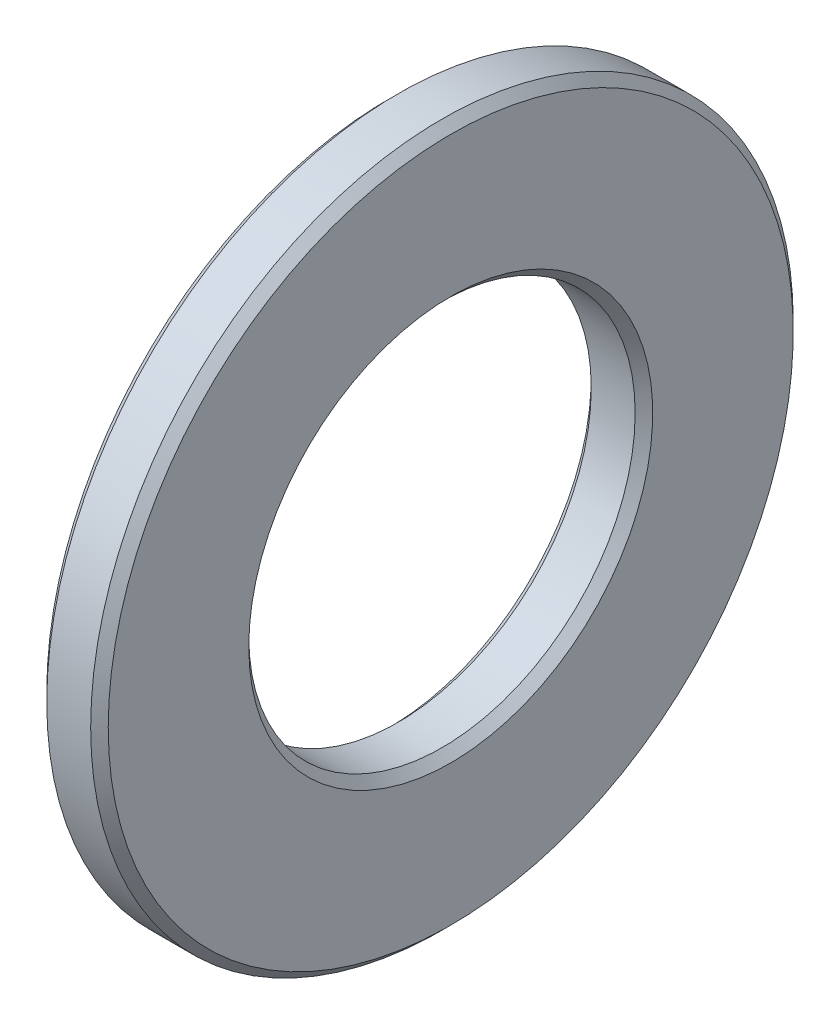
ISO-10303-21;
HEADER;
FILE_DESCRIPTION(('STEP AP214'),'2;1');
FILE_NAME('part.step','',(''),(''),'','','');
FILE_SCHEMA(('AUTOMOTIVE_DESIGN { 1 0 10303 214 1 1 1 1 }'));
ENDSEC;
DATA;
#1=APPLICATION_CONTEXT('core data for automotive mechanical design processes');
#2=APPLICATION_PROTOCOL_DEFINITION('international standard','automotive_design',2000,#1);
#3=PRODUCT_CONTEXT('',#1,'mechanical');
#4=PRODUCT('Part','Part','',(#3));
#5=PRODUCT_RELATED_PRODUCT_CATEGORY('part','',(#4));
#6=PRODUCT_DEFINITION_FORMATION('','',#4);
#7=PRODUCT_DEFINITION_CONTEXT('part definition',#1,'design');
#8=PRODUCT_DEFINITION('design','',#6,#7);
#9=PRODUCT_DEFINITION_SHAPE('','',#8);
#10=(LENGTH_UNIT() NAMED_UNIT(*) SI_UNIT(.MILLI.,.METRE.));
#11=(NAMED_UNIT(*) PLANE_ANGLE_UNIT() SI_UNIT($,.RADIAN.));
#12=(NAMED_UNIT(*) SI_UNIT($,.STERADIAN.) SOLID_ANGLE_UNIT());
#13=UNCERTAINTY_MEASURE_WITH_UNIT(LENGTH_MEASURE(1.E-05),#10,'distance_accuracy_value','');
#14=(GEOMETRIC_REPRESENTATION_CONTEXT(3) GLOBAL_UNCERTAINTY_ASSIGNED_CONTEXT((#13)) GLOBAL_UNIT_ASSIGNED_CONTEXT((#10,
#11,#12)) REPRESENTATION_CONTEXT('',''));
#15=CARTESIAN_POINT('',(0.,0.,0.));
#16=DIRECTION('',(0.,0.,1.));
#17=DIRECTION('',(1.,0.,0.));
#18=AXIS2_PLACEMENT_3D('',#15,#16,#17);
#19=CARTESIAN_POINT('',(13.436369796,1.17999999105223E-07,0.));
#20=DIRECTION('',(-1.,0.,0.));
#21=DIRECTION('',(0.,0.,1.));
#22=AXIS2_PLACEMENT_3D('',#19,#20,#21);
#23=PLANE('',#22);
#24=CARTESIAN_POINT('',(13.436369796,1.17999999105223E-07,0.));
#25=DIRECTION('',(-1.,0.,0.));
#26=DIRECTION('',(0.,0.,1.));
#27=AXIS2_PLACEMENT_3D('',#24,#25,#26);
#28=CIRCLE('',#27,19.5);
#29=CARTESIAN_POINT('',(13.436369796,1.17999999105223E-07,19.5));
#30=VERTEX_POINT('',#29);
#31=EDGE_CURVE('E10',#30,#30,#28,.T.);
#32=ORIENTED_EDGE('',*,*,#31,.T.);
#33=EDGE_LOOP('',(#32));
#34=FACE_BOUND('',#33,.T.);
#35=CARTESIAN_POINT('',(13.436369796,1.17999999105223E-07,0.));
#36=DIRECTION('',(-1.,0.,0.));
#37=DIRECTION('',(0.,0.,1.));
#38=AXIS2_PLACEMENT_3D('',#35,#36,#37);
#39=CIRCLE('',#38,11.5);
#40=CARTESIAN_POINT('',(13.436369796,1.17999999105223E-07,11.5));
#41=VERTEX_POINT('',#40);
#42=EDGE_CURVE('E57',#41,#41,#39,.F.);
#43=ORIENTED_EDGE('',*,*,#42,.T.);
#44=EDGE_LOOP('',(#43));
#45=FACE_BOUND('',#44,.T.);
#46=ADVANCED_FACE('F15',(#34,#45),#23,.T.);
#47=CARTESIAN_POINT('',(16.936369796,1.17999999105223E-07,0.));
#48=DIRECTION('',(-1.,0.,0.));
#49=DIRECTION('',(0.,0.,1.));
#50=AXIS2_PLACEMENT_3D('',#47,#48,#49);
#51=PLANE('',#50);
#52=CARTESIAN_POINT('',(16.936369796,1.17999999105223E-07,0.));
#53=DIRECTION('',(-1.,0.,0.));
#54=DIRECTION('',(0.,0.,1.));
#55=AXIS2_PLACEMENT_3D('',#52,#53,#54);
#56=CIRCLE('',#55,19.5);
#57=CARTESIAN_POINT('',(16.936369796,1.17999999105223E-07,19.5));
#58=VERTEX_POINT('',#57);
#59=EDGE_CURVE('E23',#58,#58,#56,.F.);
#60=ORIENTED_EDGE('',*,*,#59,.T.);
#61=EDGE_LOOP('',(#60));
#62=FACE_BOUND('',#61,.T.);
#63=CARTESIAN_POINT('',(16.936369796,1.17999999105223E-07,0.));
#64=DIRECTION('',(-1.,0.,0.));
#65=DIRECTION('',(0.,0.,1.));
#66=AXIS2_PLACEMENT_3D('',#63,#64,#65);
#67=CIRCLE('',#66,11.5);
#68=CARTESIAN_POINT('',(16.936369796,1.17999999105223E-07,11.5));
#69=VERTEX_POINT('',#68);
#70=EDGE_CURVE('E63',#69,#69,#67,.T.);
#71=ORIENTED_EDGE('',*,*,#70,.T.);
#72=EDGE_LOOP('',(#71));
#73=FACE_BOUND('',#72,.T.);
#74=ADVANCED_FACE('F72',(#62,#73),#51,.F.);
#75=CARTESIAN_POINT('',(13.436369796,1.17999999105223E-07,0.));
#76=DIRECTION('',(1.,0.,0.));
#77=DIRECTION('',(0.,0.,-1.));
#78=AXIS2_PLACEMENT_3D('',#75,#76,#77);
#79=CYLINDRICAL_SURFACE('',#78,20.);
#80=CARTESIAN_POINT('',(16.436369796,1.17999999105223E-07,0.));
#81=DIRECTION('',(-1.,0.,0.));
#82=DIRECTION('',(0.,0.,1.));
#83=AXIS2_PLACEMENT_3D('',#80,#81,#82);
#84=CIRCLE('',#83,20.);
#85=CARTESIAN_POINT('',(16.436369796,1.17999999105223E-07,20.));
#86=VERTEX_POINT('',#85);
#87=EDGE_CURVE('E31',#86,#86,#84,.T.);
#88=ORIENTED_EDGE('',*,*,#87,.T.);
#89=EDGE_LOOP('',(#88));
#90=FACE_BOUND('',#89,.T.);
#91=CARTESIAN_POINT('',(13.936369796,1.17999999105223E-07,0.));
#92=DIRECTION('',(1.,0.,0.));
#93=DIRECTION('',(0.,0.,-1.));
#94=AXIS2_PLACEMENT_3D('',#91,#92,#93);
#95=CIRCLE('',#94,20.);
#96=CARTESIAN_POINT('',(13.936369796,1.17999999105223E-07,-20.));
#97=VERTEX_POINT('',#96);
#98=EDGE_CURVE('E38',#97,#97,#95,.T.);
#99=ORIENTED_EDGE('',*,*,#98,.T.);
#100=EDGE_LOOP('',(#99));
#101=FACE_BOUND('',#100,.T.);
#102=ADVANCED_FACE('F88',(#90,#101),#79,.T.);
#103=CARTESIAN_POINT('',(13.436369796,1.17999999105223E-07,0.));
#104=DIRECTION('',(1.,0.,0.));
#105=DIRECTION('',(0.,0.,-1.));
#106=AXIS2_PLACEMENT_3D('',#103,#104,#105);
#107=CYLINDRICAL_SURFACE('',#106,11.);
#108=CARTESIAN_POINT('',(16.436369796,1.17999999105223E-07,0.));
#109=DIRECTION('',(-1.,0.,0.));
#110=DIRECTION('',(0.,0.,1.));
#111=AXIS2_PLACEMENT_3D('',#108,#109,#110);
#112=CIRCLE('',#111,11.);
#113=CARTESIAN_POINT('',(16.436369796,1.17999999105223E-07,11.));
#114=VERTEX_POINT('',#113);
#115=EDGE_CURVE('E41',#114,#114,#112,.F.);
#116=ORIENTED_EDGE('',*,*,#115,.T.);
#117=EDGE_LOOP('',(#116));
#118=FACE_BOUND('',#117,.T.);
#119=CARTESIAN_POINT('',(13.936369796,1.17999999105223E-07,0.));
#120=DIRECTION('',(-1.,0.,0.));
#121=DIRECTION('',(0.,0.,1.));
#122=AXIS2_PLACEMENT_3D('',#119,#120,#121);
#123=CIRCLE('',#122,11.);
#124=CARTESIAN_POINT('',(13.936369796,1.17999999105223E-07,11.));
#125=VERTEX_POINT('',#124);
#126=EDGE_CURVE('E51',#125,#125,#123,.T.);
#127=ORIENTED_EDGE('',*,*,#126,.T.);
#128=EDGE_LOOP('',(#127));
#129=FACE_BOUND('',#128,.T.);
#130=ADVANCED_FACE('F77',(#118,#129),#107,.F.);
#131=CARTESIAN_POINT('',(16.936369796,1.17999999105223E-07,0.));
#132=DIRECTION('',(1.,0.,0.));
#133=DIRECTION('',(0.,0.,-1.));
#134=AXIS2_PLACEMENT_3D('',#131,#132,#133);
#135=CONICAL_SURFACE('',#134,11.5,0.785398163397448);
#136=ORIENTED_EDGE('',*,*,#115,.F.);
#137=EDGE_LOOP('',(#136));
#138=FACE_BOUND('',#137,.T.);
#139=ORIENTED_EDGE('',*,*,#70,.F.);
#140=EDGE_LOOP('',(#139));
#141=FACE_BOUND('',#140,.T.);
#142=ADVANCED_FACE('F74',(#138,#141),#135,.F.);
#143=CARTESIAN_POINT('',(13.936369796,1.17999999105223E-07,0.));
#144=DIRECTION('',(-1.,0.,0.));
#145=DIRECTION('',(0.,0.,1.));
#146=AXIS2_PLACEMENT_3D('',#143,#144,#145);
#147=CONICAL_SURFACE('',#146,11.,0.785398163397448);
#148=ORIENTED_EDGE('',*,*,#42,.F.);
#149=EDGE_LOOP('',(#148));
#150=FACE_BOUND('',#149,.T.);
#151=ORIENTED_EDGE('',*,*,#126,.F.);
#152=EDGE_LOOP('',(#151));
#153=FACE_BOUND('',#152,.T.);
#154=ADVANCED_FACE('F76',(#150,#153),#147,.F.);
#155=CARTESIAN_POINT('',(16.436369796,1.17999999105223E-07,0.));
#156=DIRECTION('',(-1.,0.,0.));
#157=DIRECTION('',(0.,0.,1.));
#158=AXIS2_PLACEMENT_3D('',#155,#156,#157);
#159=CONICAL_SURFACE('',#158,20.,0.785398163397448);
#160=ORIENTED_EDGE('',*,*,#59,.F.);
#161=EDGE_LOOP('',(#160));
#162=FACE_BOUND('',#161,.T.);
#163=ORIENTED_EDGE('',*,*,#87,.F.);
#164=EDGE_LOOP('',(#163));
#165=FACE_BOUND('',#164,.T.);
#166=ADVANCED_FACE('F85',(#162,#165),#159,.T.);
#167=CARTESIAN_POINT('',(13.436369796,1.17999999105223E-07,0.));
#168=DIRECTION('',(1.,0.,0.));
#169=DIRECTION('',(0.,0.,-1.));
#170=AXIS2_PLACEMENT_3D('',#167,#168,#169);
#171=CONICAL_SURFACE('',#170,19.5,0.785398163397448);
#172=ORIENTED_EDGE('',*,*,#98,.F.);
#173=EDGE_LOOP('',(#172));
#174=FACE_BOUND('',#173,.T.);
#175=ORIENTED_EDGE('',*,*,#31,.F.);
#176=EDGE_LOOP('',(#175));
#177=FACE_BOUND('',#176,.T.);
#178=ADVANCED_FACE('F17',(#174,#177),#171,.T.);
#179=CLOSED_SHELL('',(#46,#74,#102,#130,#142,#154,#166,#178));
#180=MANIFOLD_SOLID_BREP('B1',#179);
#181=ADVANCED_BREP_SHAPE_REPRESENTATION('',(#18,#180),#14);
#182=SHAPE_DEFINITION_REPRESENTATION(#9,#181);
ENDSEC;
END-ISO-10303-21;
